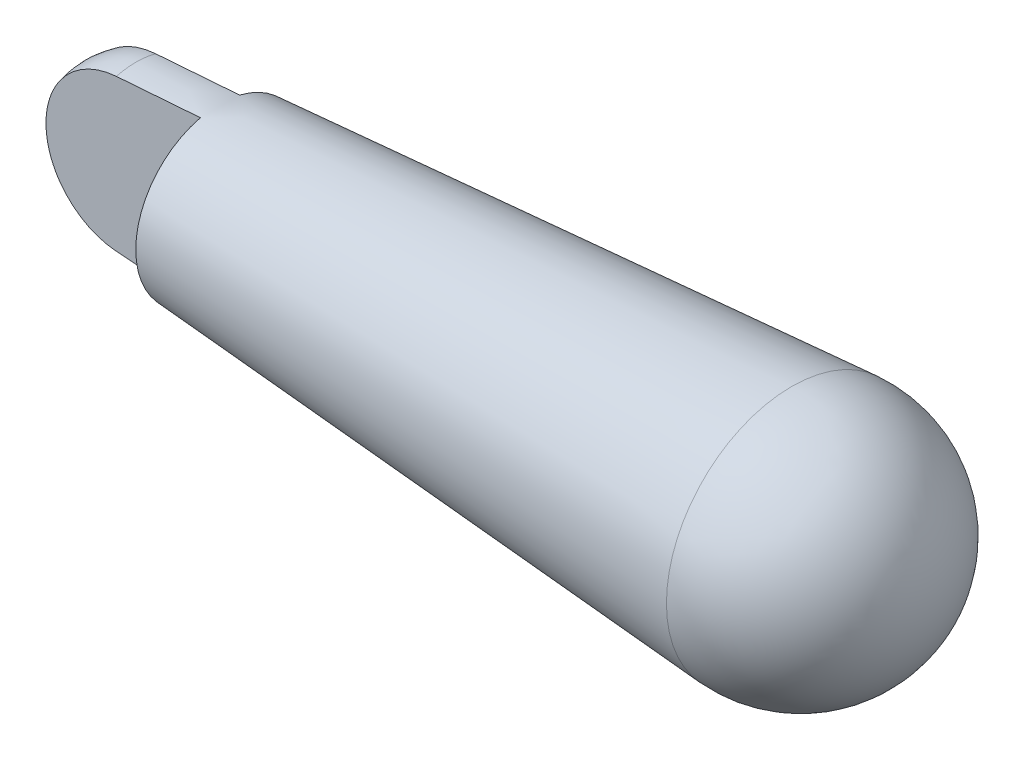
ISO-10303-21;
HEADER;
FILE_DESCRIPTION(('STEP AP214'),'2;1');
FILE_NAME('part.step','',(''),(''),'','','');
FILE_SCHEMA(('AUTOMOTIVE_DESIGN { 1 0 10303 214 1 1 1 1 }'));
ENDSEC;
DATA;
#1=APPLICATION_CONTEXT('core data for automotive mechanical design processes');
#2=APPLICATION_PROTOCOL_DEFINITION('international standard','automotive_design',2000,#1);
#3=PRODUCT_CONTEXT('',#1,'mechanical');
#4=PRODUCT('Part','Part','',(#3));
#5=PRODUCT_RELATED_PRODUCT_CATEGORY('part','',(#4));
#6=PRODUCT_DEFINITION_FORMATION('','',#4);
#7=PRODUCT_DEFINITION_CONTEXT('part definition',#1,'design');
#8=PRODUCT_DEFINITION('design','',#6,#7);
#9=PRODUCT_DEFINITION_SHAPE('','',#8);
#10=(LENGTH_UNIT() NAMED_UNIT(*) SI_UNIT(.MILLI.,.METRE.));
#11=(NAMED_UNIT(*) PLANE_ANGLE_UNIT() SI_UNIT($,.RADIAN.));
#12=(NAMED_UNIT(*) SI_UNIT($,.STERADIAN.) SOLID_ANGLE_UNIT());
#13=UNCERTAINTY_MEASURE_WITH_UNIT(LENGTH_MEASURE(1.E-05),#10,'distance_accuracy_value','');
#14=(GEOMETRIC_REPRESENTATION_CONTEXT(3) GLOBAL_UNCERTAINTY_ASSIGNED_CONTEXT((#13)) GLOBAL_UNIT_ASSIGNED_CONTEXT((#10,
#11,#12)) REPRESENTATION_CONTEXT('',''));
#15=CARTESIAN_POINT('',(0.,0.,0.));
#16=DIRECTION('',(0.,0.,1.));
#17=DIRECTION('',(1.,0.,0.));
#18=AXIS2_PLACEMENT_3D('',#15,#16,#17);
#19=CARTESIAN_POINT('',(-213.36,0.,0.));
#20=DIRECTION('',(-1.,0.,0.));
#21=DIRECTION('',(0.,1.,0.));
#22=AXIS2_PLACEMENT_3D('',#19,#20,#21);
#23=SPHERICAL_SURFACE('',#22,50.8);
#24=CARTESIAN_POINT('',(-213.36,0.,12.7));
#25=DIRECTION('',(0.,0.,1.));
#26=DIRECTION('',(1.,0.,0.));
#27=AXIS2_PLACEMENT_3D('',#24,#25,#26);
#28=CIRCLE('',#27,49.1868884968342);
#29=CARTESIAN_POINT('',(-216.988571428571,49.0528640283904,12.7));
#30=VERTEX_POINT('',#29);
#31=CARTESIAN_POINT('',(-216.988571428571,-49.0528640283904,12.7));
#32=VERTEX_POINT('',#31);
#33=EDGE_CURVE('E77',#30,#32,#28,.T.);
#34=ORIENTED_EDGE('',*,*,#33,.F.);
#35=CARTESIAN_POINT('',(-216.988571428571,0.,0.));
#36=DIRECTION('',(-1.,0.,0.));
#37=DIRECTION('',(0.,0.,1.));
#38=AXIS2_PLACEMENT_3D('',#35,#36,#37);
#39=CIRCLE('',#38,50.670242444533);
#40=CARTESIAN_POINT('',(-216.988571428571,49.0528640283904,-12.7));
#41=VERTEX_POINT('',#40);
#42=EDGE_CURVE('E58',#30,#41,#39,.T.);
#43=ORIENTED_EDGE('',*,*,#42,.T.);
#44=CARTESIAN_POINT('',(-213.36,0.,-12.7));
#45=DIRECTION('',(0.,0.,-1.));
#46=DIRECTION('',(-1.,0.,0.));
#47=AXIS2_PLACEMENT_3D('',#44,#45,#46);
#48=CIRCLE('',#47,49.1868884968342);
#49=CARTESIAN_POINT('',(-216.988571428571,-49.0528640283904,-12.7));
#50=VERTEX_POINT('',#49);
#51=EDGE_CURVE('E126',#50,#41,#48,.T.);
#52=ORIENTED_EDGE('',*,*,#51,.F.);
#53=EDGE_CURVE('E129',#50,#32,#39,.T.);
#54=ORIENTED_EDGE('',*,*,#53,.T.);
#55=EDGE_LOOP('',(#34,#43,#52,#54));
#56=FACE_BOUND('',#55,.T.);
#57=ADVANCED_FACE('F32',(#56),#23,.T.);
#58=CARTESIAN_POINT('',(207.554285714286,0.,0.));
#59=DIRECTION('',(1.,0.,0.));
#60=DIRECTION('',(0.,0.,-1.));
#61=AXIS2_PLACEMENT_3D('',#58,#59,#60);
#62=CONICAL_SURFACE('',#61,81.0723879112528,0.0714894498855206);
#63=CARTESIAN_POINT('',(207.554285714286,0.,0.));
#64=DIRECTION('',(-1.,0.,0.));
#65=DIRECTION('',(0.,0.,1.));
#66=AXIS2_PLACEMENT_3D('',#63,#64,#65);
#67=CIRCLE('',#66,81.0723879112528);
#68=CARTESIAN_POINT('',(207.554285714286,0.,81.0723879112528));
#69=VERTEX_POINT('',#68);
#70=EDGE_CURVE('E119',#69,#69,#67,.T.);
#71=ORIENTED_EDGE('',*,*,#70,.T.);
#72=EDGE_LOOP('',(#71));
#73=FACE_BOUND('',#72,.T.);
#74=CARTESIAN_POINT('',(-298.842770341633,-42.9710995002838,12.7));
#75=CARTESIAN_POINT('',(-284.941034960854,-44.0091426761388,12.7));
#76=CARTESIAN_POINT('',(-271.039082937217,-45.04428033062,12.7));
#77=CARTESIAN_POINT('',(-243.234815570956,-47.1096576229592,12.7));
#78=CARTESIAN_POINT('',(-229.332500228346,-48.139897261018,12.7));
#79=CARTESIAN_POINT('',(-211.153298695911,-49.4844585347737,12.7));
#80=CARTESIAN_POINT('',(-206.876545817793,-49.8005840717169,12.7));
#81=CARTESIAN_POINT('',(-186.558846437315,-51.3015598124624,12.7));
#82=CARTESIAN_POINT('',(-170.517727831115,-52.4840807272727,12.7));
#83=CARTESIAN_POINT('',(-138.435186861438,-54.8449950920606,12.7));
#84=CARTESIAN_POINT('',(-122.393764497961,-56.0233885420422,12.7));
#85=CARTESIAN_POINT('',(-106.352223635125,-57.2001620628847,12.7));
#86=B_SPLINE_CURVE_WITH_KNOTS('',3,(#74,#75,#76,#77,#78,#79,#80,#81,#82,#83,#84,#85),
.UNSPECIFIED.,.F.,.F.,(4,2,2,2,2,4),(0.,41.8213098992768,83.6426180841304,96.5078796343589,
144.761817424874,193.015755167486),.UNSPECIFIED.);
#87=CARTESIAN_POINT('',(-162.56,-53.0694972508836,12.7));
#88=VERTEX_POINT('',#87);
#89=EDGE_CURVE('E11',#32,#88,#86,.T.);
#90=ORIENTED_EDGE('',*,*,#89,.F.);
#91=ORIENTED_EDGE('',*,*,#53,.F.);
#92=CARTESIAN_POINT('',(-106.352223635125,-57.2001620628847,-12.7));
#93=CARTESIAN_POINT('',(-122.393765610006,-56.0233910475282,-12.7));
#94=CARTESIAN_POINT('',(-138.435188676151,-54.8449962522903,-12.7));
#95=CARTESIAN_POINT('',(-170.517729372886,-52.4840793200198,-12.7));
#96=CARTESIAN_POINT('',(-186.558847003508,-51.3015571834149,-12.7));
#97=CARTESIAN_POINT('',(-218.640713180354,-48.9315054952377,-12.7));
#98=CARTESIAN_POINT('',(-234.681461726564,-47.7439759434642,-12.7));
#99=CARTESIAN_POINT('',(-258.742236448641,-45.9579810419612,-12.7));
#100=CARTESIAN_POINT('',(-266.762437092755,-45.3618659478398,-12.7));
#101=CARTESIAN_POINT('',(-282.802706532681,-44.1678633854732,-12.7));
#102=CARTESIAN_POINT('',(-290.82277532849,-43.569975917208,-12.7));
#103=CARTESIAN_POINT('',(-298.842770341633,-42.9710995002838,-12.7));
#104=B_SPLINE_CURVE_WITH_KNOTS('',3,(#92,#93,#94,#95,#96,#97,#98,#99,#100,#101,#102,#103),
.UNSPECIFIED.,.F.,.F.,(4,2,2,2,2,4),(0.,48.2539402667828,96.5078755331268,144.761812738291,
168.888783865642,193.015755265125),.UNSPECIFIED.);
#105=CARTESIAN_POINT('',(-162.56,-53.0694972508836,-12.7));
#106=VERTEX_POINT('',#105);
#107=EDGE_CURVE('E88',#106,#50,#104,.T.);
#108=ORIENTED_EDGE('',*,*,#107,.F.);
#109=CARTESIAN_POINT('',(-162.56,0.,0.));
#110=DIRECTION('',(-1.,0.,0.));
#111=DIRECTION('',(0.,0.,1.));
#112=AXIS2_PLACEMENT_3D('',#109,#110,#111);
#113=CIRCLE('',#112,54.5679534018048);
#114=CARTESIAN_POINT('',(-162.56,53.0694972508836,-12.7));
#115=VERTEX_POINT('',#114);
#116=EDGE_CURVE('E118',#115,#106,#113,.T.);
#117=ORIENTED_EDGE('',*,*,#116,.F.);
#118=CARTESIAN_POINT('',(-298.842770341633,42.9710995002838,-12.7));
#119=CARTESIAN_POINT('',(-284.941034960854,44.0091426761388,-12.7));
#120=CARTESIAN_POINT('',(-271.039082937217,45.04428033062,-12.7));
#121=CARTESIAN_POINT('',(-243.234815570956,47.1096576229592,-12.7));
#122=CARTESIAN_POINT('',(-229.332500228346,48.139897261018,-12.7));
#123=CARTESIAN_POINT('',(-211.153298695911,49.4844585347737,-12.7));
#124=CARTESIAN_POINT('',(-206.876545817793,49.8005840717169,-12.7));
#125=CARTESIAN_POINT('',(-186.558846437315,51.3015598124624,-12.7));
#126=CARTESIAN_POINT('',(-170.517727831115,52.4840807272727,-12.7));
#127=CARTESIAN_POINT('',(-138.435186861438,54.8449950920606,-12.7));
#128=CARTESIAN_POINT('',(-122.393764497961,56.0233885420422,-12.7));
#129=CARTESIAN_POINT('',(-106.352223635125,57.2001620628847,-12.7));
#130=B_SPLINE_CURVE_WITH_KNOTS('',3,(#118,#119,#120,#121,#122,#123,#124,#125,#126,#127,#128,
#129),.UNSPECIFIED.,.F.,.F.,(4,2,2,2,2,4),(0.,41.8213098992768,83.6426180841304,
96.5078796343589,144.761817424874,193.015755167486),.UNSPECIFIED.);
#131=EDGE_CURVE('E113',#41,#115,#130,.T.);
#132=ORIENTED_EDGE('',*,*,#131,.F.);
#133=ORIENTED_EDGE('',*,*,#42,.F.);
#134=CARTESIAN_POINT('',(-106.352223635125,57.2001620628847,12.7));
#135=CARTESIAN_POINT('',(-122.393765610006,56.0233910475282,12.7));
#136=CARTESIAN_POINT('',(-138.435188676151,54.8449962522903,12.7));
#137=CARTESIAN_POINT('',(-170.517729372886,52.4840793200198,12.7));
#138=CARTESIAN_POINT('',(-186.558847003508,51.3015571834149,12.7));
#139=CARTESIAN_POINT('',(-218.640713180354,48.9315054952377,12.7));
#140=CARTESIAN_POINT('',(-234.681461726564,47.7439759434642,12.7));
#141=CARTESIAN_POINT('',(-258.742236448641,45.9579810419612,12.7));
#142=CARTESIAN_POINT('',(-266.762437092755,45.3618659478398,12.7));
#143=CARTESIAN_POINT('',(-282.802706532681,44.1678633854732,12.7));
#144=CARTESIAN_POINT('',(-290.82277532849,43.569975917208,12.7));
#145=CARTESIAN_POINT('',(-298.842770341633,42.9710995002838,12.7));
#146=B_SPLINE_CURVE_WITH_KNOTS('',3,(#134,#135,#136,#137,#138,#139,#140,#141,#142,#143,#144,
#145),.UNSPECIFIED.,.F.,.F.,(4,2,2,2,2,4),(0.,48.2539402667828,96.5078755331268,
144.761812738291,168.888783865642,193.015755265125),.UNSPECIFIED.);
#147=CARTESIAN_POINT('',(-162.56,53.0694972508836,12.7));
#148=VERTEX_POINT('',#147);
#149=EDGE_CURVE('E87',#148,#30,#146,.T.);
#150=ORIENTED_EDGE('',*,*,#149,.F.);
#151=CARTESIAN_POINT('',(-162.56,0.,-1.60921337305558E-13));
#152=DIRECTION('',(-1.,0.,0.));
#153=DIRECTION('',(0.,0.,1.));
#154=AXIS2_PLACEMENT_3D('',#151,#152,#153);
#155=CIRCLE('',#154,54.5679534018048);
#156=EDGE_CURVE('E44',#88,#148,#155,.T.);
#157=ORIENTED_EDGE('',*,*,#156,.F.);
#158=EDGE_LOOP('',(#90,#91,#108,#117,#132,#133,#150,#157));
#159=FACE_BOUND('',#158,.T.);
#160=ADVANCED_FACE('F86',(#73,#159),#62,.T.);
#161=CARTESIAN_POINT('',(213.36,0.,0.));
#162=DIRECTION('',(-1.,0.,0.));
#163=DIRECTION('',(0.,1.,0.));
#164=AXIS2_PLACEMENT_3D('',#161,#162,#163);
#165=SPHERICAL_SURFACE('',#164,81.28);
#166=ORIENTED_EDGE('',*,*,#70,.F.);
#167=EDGE_LOOP('',(#166));
#168=FACE_BOUND('',#167,.T.);
#169=ADVANCED_FACE('F137',(#168),#165,.T.);
#170=CARTESIAN_POINT('',(-162.56,157.48,-139.7));
#171=DIRECTION('',(-1.,0.,0.));
#172=DIRECTION('',(0.,0.,1.));
#173=AXIS2_PLACEMENT_3D('',#170,#171,#172);
#174=PLANE('',#173);
#175=ORIENTED_EDGE('',*,*,#116,.T.);
#176=DIRECTION('',(0.,-1.,0.));
#177=VECTOR('',#176,1.);
#178=CARTESIAN_POINT('',(-162.56,157.48,-12.7));
#179=LINE('',#178,#177);
#180=EDGE_CURVE('E128',#115,#106,#179,.T.);
#181=ORIENTED_EDGE('',*,*,#180,.F.);
#182=EDGE_LOOP('',(#175,#181));
#183=FACE_BOUND('',#182,.T.);
#184=ADVANCED_FACE('F109',(#183),#174,.T.);
#185=CARTESIAN_POINT('',(-264.16,157.48,-12.7));
#186=DIRECTION('',(0.,0.,-1.));
#187=DIRECTION('',(-1.,0.,0.));
#188=AXIS2_PLACEMENT_3D('',#185,#186,#187);
#189=PLANE('',#188);
#190=ORIENTED_EDGE('',*,*,#107,.T.);
#191=ORIENTED_EDGE('',*,*,#51,.T.);
#192=ORIENTED_EDGE('',*,*,#131,.T.);
#193=ORIENTED_EDGE('',*,*,#180,.T.);
#194=EDGE_LOOP('',(#190,#191,#192,#193));
#195=FACE_BOUND('',#194,.T.);
#196=ADVANCED_FACE('F106',(#195),#189,.T.);
#197=CARTESIAN_POINT('',(-162.56,157.48,139.7));
#198=DIRECTION('',(-1.,0.,0.));
#199=DIRECTION('',(0.,0.,1.));
#200=AXIS2_PLACEMENT_3D('',#197,#198,#199);
#201=PLANE('',#200);
#202=ORIENTED_EDGE('',*,*,#156,.T.);
#203=DIRECTION('',(0.,-1.,0.));
#204=VECTOR('',#203,1.);
#205=CARTESIAN_POINT('',(-162.56,157.48,12.7));
#206=LINE('',#205,#204);
#207=EDGE_CURVE('E50',#148,#88,#206,.T.);
#208=ORIENTED_EDGE('',*,*,#207,.T.);
#209=EDGE_LOOP('',(#202,#208));
#210=FACE_BOUND('',#209,.T.);
#211=ADVANCED_FACE('F83',(#210),#201,.T.);
#212=CARTESIAN_POINT('',(-264.16,157.48,12.7));
#213=DIRECTION('',(0.,0.,1.));
#214=DIRECTION('',(1.,0.,0.));
#215=AXIS2_PLACEMENT_3D('',#212,#213,#214);
#216=PLANE('',#215);
#217=ORIENTED_EDGE('',*,*,#89,.T.);
#218=ORIENTED_EDGE('',*,*,#207,.F.);
#219=ORIENTED_EDGE('',*,*,#149,.T.);
#220=ORIENTED_EDGE('',*,*,#33,.T.);
#221=EDGE_LOOP('',(#217,#218,#219,#220));
#222=FACE_BOUND('',#221,.T.);
#223=ADVANCED_FACE('F76',(#222),#216,.T.);
#224=CLOSED_SHELL('',(#57,#160,#169,#184,#196,#211,#223));
#225=MANIFOLD_SOLID_BREP('B2',#224);
#226=ADVANCED_BREP_SHAPE_REPRESENTATION('',(#18,#225),#14);
#227=SHAPE_DEFINITION_REPRESENTATION(#9,#226);
ENDSEC;
END-ISO-10303-21;
